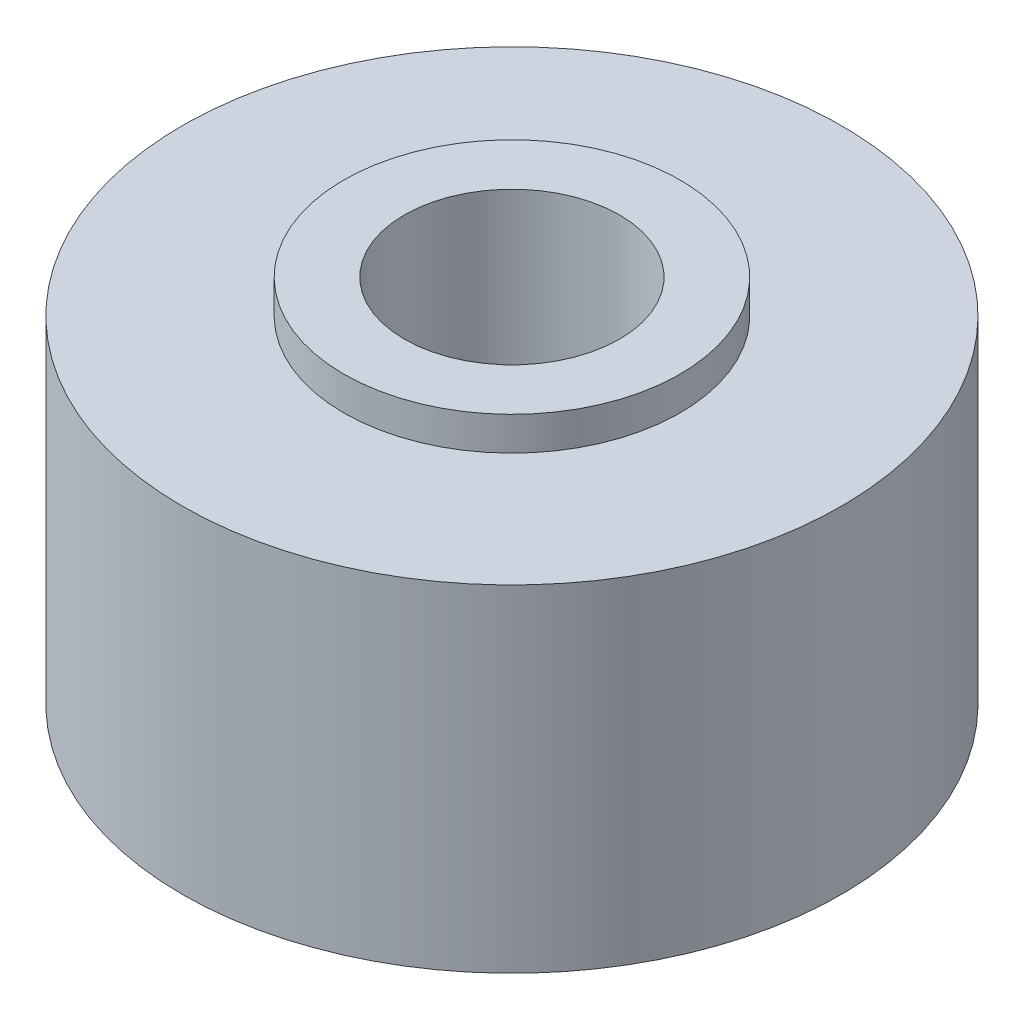
ISO-10303-21;
HEADER;
FILE_DESCRIPTION(('STEP AP214'),'2;1');
FILE_NAME('part.step','',(''),(''),'','','');
FILE_SCHEMA(('AUTOMOTIVE_DESIGN { 1 0 10303 214 1 1 1 1 }'));
ENDSEC;
DATA;
#1=APPLICATION_CONTEXT('core data for automotive mechanical design processes');
#2=APPLICATION_PROTOCOL_DEFINITION('international standard','automotive_design',2000,#1);
#3=PRODUCT_CONTEXT('',#1,'mechanical');
#4=PRODUCT('Part','Part','',(#3));
#5=PRODUCT_RELATED_PRODUCT_CATEGORY('part','',(#4));
#6=PRODUCT_DEFINITION_FORMATION('','',#4);
#7=PRODUCT_DEFINITION_CONTEXT('part definition',#1,'design');
#8=PRODUCT_DEFINITION('design','',#6,#7);
#9=PRODUCT_DEFINITION_SHAPE('','',#8);
#10=(LENGTH_UNIT() NAMED_UNIT(*) SI_UNIT(.MILLI.,.METRE.));
#11=(NAMED_UNIT(*) PLANE_ANGLE_UNIT() SI_UNIT($,.RADIAN.));
#12=(NAMED_UNIT(*) SI_UNIT($,.STERADIAN.) SOLID_ANGLE_UNIT());
#13=UNCERTAINTY_MEASURE_WITH_UNIT(LENGTH_MEASURE(1.E-05),#10,'distance_accuracy_value','');
#14=(GEOMETRIC_REPRESENTATION_CONTEXT(3) GLOBAL_UNCERTAINTY_ASSIGNED_CONTEXT((#13)) GLOBAL_UNIT_ASSIGNED_CONTEXT((#10,
#11,#12)) REPRESENTATION_CONTEXT('',''));
#15=CARTESIAN_POINT('',(0.,0.,0.));
#16=DIRECTION('',(0.,0.,1.));
#17=DIRECTION('',(1.,0.,0.));
#18=AXIS2_PLACEMENT_3D('',#15,#16,#17);
#19=CARTESIAN_POINT('',(0.,5.,0.));
#20=DIRECTION('',(0.,1.,0.));
#21=DIRECTION('',(0.,0.,1.));
#22=AXIS2_PLACEMENT_3D('',#19,#20,#21);
#23=PLANE('',#22);
#24=CARTESIAN_POINT('',(0.,5.,0.));
#25=DIRECTION('',(0.,1.,0.));
#26=DIRECTION('',(0.,0.,1.));
#27=AXIS2_PLACEMENT_3D('',#24,#25,#26);
#28=CIRCLE('',#27,4.9);
#29=CARTESIAN_POINT('',(0.,5.,4.9));
#30=VERTEX_POINT('',#29);
#31=EDGE_CURVE('E10',#30,#30,#28,.T.);
#32=ORIENTED_EDGE('',*,*,#31,.T.);
#33=EDGE_LOOP('',(#32));
#34=FACE_BOUND('',#33,.T.);
#35=CARTESIAN_POINT('',(0.,5.,0.));
#36=DIRECTION('',(0.,1.,0.));
#37=DIRECTION('',(0.,0.,1.));
#38=AXIS2_PLACEMENT_3D('',#35,#36,#37);
#39=CIRCLE('',#38,2.5);
#40=CARTESIAN_POINT('',(0.,5.,2.5));
#41=VERTEX_POINT('',#40);
#42=EDGE_CURVE('E56',#41,#41,#39,.T.);
#43=ORIENTED_EDGE('',*,*,#42,.F.);
#44=EDGE_LOOP('',(#43));
#45=FACE_BOUND('',#44,.T.);
#46=ADVANCED_FACE('F37',(#34,#45),#23,.T.);
#47=CARTESIAN_POINT('',(0.,0.,0.));
#48=DIRECTION('',(0.,1.,0.));
#49=DIRECTION('',(0.,0.,1.));
#50=AXIS2_PLACEMENT_3D('',#47,#48,#49);
#51=PLANE('',#50);
#52=CARTESIAN_POINT('',(0.,0.,0.));
#53=DIRECTION('',(0.,1.,0.));
#54=DIRECTION('',(0.,0.,1.));
#55=AXIS2_PLACEMENT_3D('',#52,#53,#54);
#56=CIRCLE('',#55,4.9);
#57=CARTESIAN_POINT('',(0.,0.,4.9));
#58=VERTEX_POINT('',#57);
#59=EDGE_CURVE('E41',#58,#58,#56,.T.);
#60=ORIENTED_EDGE('',*,*,#59,.F.);
#61=EDGE_LOOP('',(#60));
#62=FACE_BOUND('',#61,.T.);
#63=CARTESIAN_POINT('',(0.,0.,0.));
#64=DIRECTION('',(0.,1.,0.));
#65=DIRECTION('',(0.,0.,1.));
#66=AXIS2_PLACEMENT_3D('',#63,#64,#65);
#67=CIRCLE('',#66,1.6);
#68=CARTESIAN_POINT('',(0.,0.,1.6));
#69=VERTEX_POINT('',#68);
#70=EDGE_CURVE('E50',#69,#69,#67,.T.);
#71=ORIENTED_EDGE('',*,*,#70,.T.);
#72=EDGE_LOOP('',(#71));
#73=FACE_BOUND('',#72,.T.);
#74=ADVANCED_FACE('F84',(#62,#73),#51,.F.);
#75=CARTESIAN_POINT('',(0.,5.,0.));
#76=DIRECTION('',(0.,-1.,0.));
#77=DIRECTION('',(0.,0.,-1.));
#78=AXIS2_PLACEMENT_3D('',#75,#76,#77);
#79=CYLINDRICAL_SURFACE('',#78,4.9);
#80=ORIENTED_EDGE('',*,*,#31,.F.);
#81=EDGE_LOOP('',(#80));
#82=FACE_BOUND('',#81,.T.);
#83=ORIENTED_EDGE('',*,*,#59,.T.);
#84=EDGE_LOOP('',(#83));
#85=FACE_BOUND('',#84,.T.);
#86=ADVANCED_FACE('F39',(#82,#85),#79,.T.);
#87=CARTESIAN_POINT('',(0.,5.,0.));
#88=DIRECTION('',(0.,-1.,0.));
#89=DIRECTION('',(0.,0.,-1.));
#90=AXIS2_PLACEMENT_3D('',#87,#88,#89);
#91=CYLINDRICAL_SURFACE('',#90,1.6);
#92=ORIENTED_EDGE('',*,*,#70,.F.);
#93=EDGE_LOOP('',(#92));
#94=FACE_BOUND('',#93,.T.);
#95=CARTESIAN_POINT('',(0.,5.5,0.));
#96=DIRECTION('',(0.,1.,0.));
#97=DIRECTION('',(0.,0.,1.));
#98=AXIS2_PLACEMENT_3D('',#95,#96,#97);
#99=CIRCLE('',#98,1.6);
#100=CARTESIAN_POINT('',(0.,5.5,1.6));
#101=VERTEX_POINT('',#100);
#102=EDGE_CURVE('E60',#101,#101,#99,.T.);
#103=ORIENTED_EDGE('',*,*,#102,.T.);
#104=EDGE_LOOP('',(#103));
#105=FACE_BOUND('',#104,.T.);
#106=ADVANCED_FACE('F68',(#94,#105),#91,.F.);
#107=CARTESIAN_POINT('',(0.,5.5,0.));
#108=DIRECTION('',(0.,1.,0.));
#109=DIRECTION('',(0.,0.,1.));
#110=AXIS2_PLACEMENT_3D('',#107,#108,#109);
#111=PLANE('',#110);
#112=CARTESIAN_POINT('',(0.,5.5,0.));
#113=DIRECTION('',(0.,1.,0.));
#114=DIRECTION('',(0.,0.,1.));
#115=AXIS2_PLACEMENT_3D('',#112,#113,#114);
#116=CIRCLE('',#115,2.5);
#117=CARTESIAN_POINT('',(0.,5.5,2.5));
#118=VERTEX_POINT('',#117);
#119=EDGE_CURVE('E55',#118,#118,#116,.T.);
#120=ORIENTED_EDGE('',*,*,#119,.T.);
#121=EDGE_LOOP('',(#120));
#122=FACE_BOUND('',#121,.T.);
#123=ORIENTED_EDGE('',*,*,#102,.F.);
#124=EDGE_LOOP('',(#123));
#125=FACE_BOUND('',#124,.T.);
#126=ADVANCED_FACE('F70',(#122,#125),#111,.T.);
#127=CARTESIAN_POINT('',(0.,5.5,0.));
#128=DIRECTION('',(0.,-1.,0.));
#129=DIRECTION('',(0.,0.,-1.));
#130=AXIS2_PLACEMENT_3D('',#127,#128,#129);
#131=CYLINDRICAL_SURFACE('',#130,2.5);
#132=ORIENTED_EDGE('',*,*,#119,.F.);
#133=EDGE_LOOP('',(#132));
#134=FACE_BOUND('',#133,.T.);
#135=ORIENTED_EDGE('',*,*,#42,.T.);
#136=EDGE_LOOP('',(#135));
#137=FACE_BOUND('',#136,.T.);
#138=ADVANCED_FACE('F72',(#134,#137),#131,.T.);
#139=CLOSED_SHELL('',(#46,#74,#86,#106,#126,#138));
#140=MANIFOLD_SOLID_BREP('B2',#139);
#141=ADVANCED_BREP_SHAPE_REPRESENTATION('',(#18,#140),#14);
#142=SHAPE_DEFINITION_REPRESENTATION(#9,#141);
ENDSEC;
END-ISO-10303-21;
